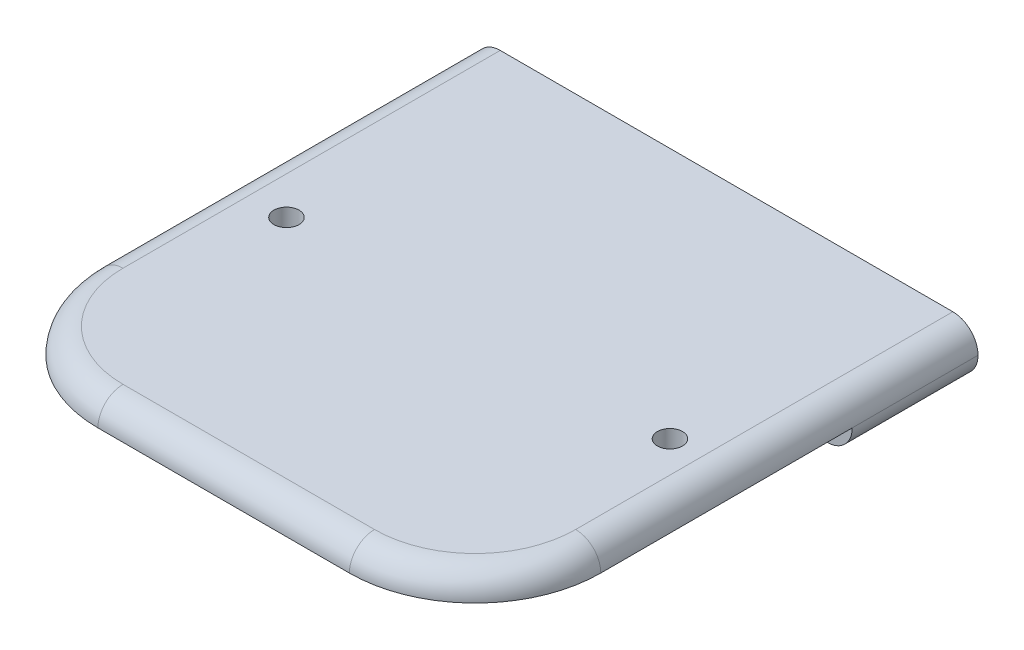
ISO-10303-21;
HEADER;
FILE_DESCRIPTION(('STEP AP214'),'2;1');
FILE_NAME('part.step','',(''),(''),'','','');
FILE_SCHEMA(('AUTOMOTIVE_DESIGN { 1 0 10303 214 1 1 1 1 }'));
ENDSEC;
DATA;
#1=APPLICATION_CONTEXT('core data for automotive mechanical design processes');
#2=APPLICATION_PROTOCOL_DEFINITION('international standard','automotive_design',2000,#1);
#3=PRODUCT_CONTEXT('',#1,'mechanical');
#4=PRODUCT('Part','Part','',(#3));
#5=PRODUCT_RELATED_PRODUCT_CATEGORY('part','',(#4));
#6=PRODUCT_DEFINITION_FORMATION('','',#4);
#7=PRODUCT_DEFINITION_CONTEXT('part definition',#1,'design');
#8=PRODUCT_DEFINITION('design','',#6,#7);
#9=PRODUCT_DEFINITION_SHAPE('','',#8);
#10=(LENGTH_UNIT() NAMED_UNIT(*) SI_UNIT(.MILLI.,.METRE.));
#11=(NAMED_UNIT(*) PLANE_ANGLE_UNIT() SI_UNIT($,.RADIAN.));
#12=(NAMED_UNIT(*) SI_UNIT($,.STERADIAN.) SOLID_ANGLE_UNIT());
#13=UNCERTAINTY_MEASURE_WITH_UNIT(LENGTH_MEASURE(1.E-05),#10,'distance_accuracy_value','');
#14=(GEOMETRIC_REPRESENTATION_CONTEXT(3) GLOBAL_UNCERTAINTY_ASSIGNED_CONTEXT((#13)) GLOBAL_UNIT_ASSIGNED_CONTEXT((#10,
#11,#12)) REPRESENTATION_CONTEXT('',''));
#15=CARTESIAN_POINT('',(0.,0.,0.));
#16=DIRECTION('',(0.,0.,1.));
#17=DIRECTION('',(1.,0.,0.));
#18=AXIS2_PLACEMENT_3D('',#15,#16,#17);
#19=CARTESIAN_POINT('',(0.,0.,40.));
#20=DIRECTION('',(0.,1.,0.));
#21=DIRECTION('',(0.,0.,1.));
#22=AXIS2_PLACEMENT_3D('',#19,#20,#21);
#23=PLANE('',#22);
#24=DIRECTION('',(1.,0.,0.));
#25=VECTOR('',#24,1.);
#26=CARTESIAN_POINT('',(0.,0.,10.));
#27=LINE('',#26,#25);
#28=CARTESIAN_POINT('',(2.,0.,10.));
#29=VERTEX_POINT('',#28);
#30=CARTESIAN_POINT('',(38.,0.,10.));
#31=VERTEX_POINT('',#30);
#32=EDGE_CURVE('E128',#29,#31,#27,.T.);
#33=ORIENTED_EDGE('',*,*,#32,.F.);
#34=DIRECTION('',(0.,0.,-1.));
#35=VECTOR('',#34,1.);
#36=CARTESIAN_POINT('',(2.,0.,40.));
#37=LINE('',#36,#35);
#38=CARTESIAN_POINT('',(2.,0.,0.));
#39=VERTEX_POINT('',#38);
#40=EDGE_CURVE('E136',#29,#39,#37,.T.);
#41=ORIENTED_EDGE('',*,*,#40,.T.);
#42=DIRECTION('',(1.,0.,0.));
#43=VECTOR('',#42,1.);
#44=CARTESIAN_POINT('',(0.,0.,0.));
#45=LINE('',#44,#43);
#46=CARTESIAN_POINT('',(38.,0.,0.));
#47=VERTEX_POINT('',#46);
#48=EDGE_CURVE('E211',#39,#47,#45,.T.);
#49=ORIENTED_EDGE('',*,*,#48,.T.);
#50=DIRECTION('',(0.,0.,-1.));
#51=VECTOR('',#50,1.);
#52=CARTESIAN_POINT('',(38.,0.,40.));
#53=LINE('',#52,#51);
#54=EDGE_CURVE('E143',#47,#31,#53,.F.);
#55=ORIENTED_EDGE('',*,*,#54,.T.);
#56=EDGE_LOOP('',(#33,#41,#49,#55));
#57=FACE_BOUND('',#56,.T.);
#58=ADVANCED_FACE('F38',(#57),#23,.F.);
#59=CARTESIAN_POINT('',(0.,4.,40.));
#60=DIRECTION('',(0.,-1.,0.));
#61=DIRECTION('',(0.,0.,-1.));
#62=AXIS2_PLACEMENT_3D('',#59,#60,#61);
#63=PLANE('',#62);
#64=CARTESIAN_POINT('',(5.00000000000001,4.,20.));
#65=DIRECTION('',(0.,1.,0.));
#66=DIRECTION('',(0.,0.,1.));
#67=AXIS2_PLACEMENT_3D('',#64,#65,#66);
#68=CIRCLE('',#67,1.);
#69=CARTESIAN_POINT('',(5.00000000000001,4.,21.));
#70=VERTEX_POINT('',#69);
#71=EDGE_CURVE('E158',#70,#70,#68,.T.);
#72=ORIENTED_EDGE('',*,*,#71,.F.);
#73=EDGE_LOOP('',(#72));
#74=FACE_BOUND('',#73,.T.);
#75=CARTESIAN_POINT('',(35.5,4.,20.));
#76=DIRECTION('',(0.,1.,0.));
#77=DIRECTION('',(0.,0.,1.));
#78=AXIS2_PLACEMENT_3D('',#75,#76,#77);
#79=CIRCLE('',#78,0.999999999999998);
#80=CARTESIAN_POINT('',(35.5,4.,21.));
#81=VERTEX_POINT('',#80);
#82=EDGE_CURVE('E203',#81,#81,#79,.T.);
#83=ORIENTED_EDGE('',*,*,#82,.F.);
#84=EDGE_LOOP('',(#83));
#85=FACE_BOUND('',#84,.T.);
#86=DIRECTION('',(-1.,0.,0.));
#87=VECTOR('',#86,1.);
#88=CARTESIAN_POINT('',(0.,4.,0.));
#89=LINE('',#88,#87);
#90=CARTESIAN_POINT('',(38.,4.,0.));
#91=VERTEX_POINT('',#90);
#92=CARTESIAN_POINT('',(2.,4.,0.));
#93=VERTEX_POINT('',#92);
#94=EDGE_CURVE('E198',#91,#93,#89,.T.);
#95=ORIENTED_EDGE('',*,*,#94,.T.);
#96=DIRECTION('',(0.,0.,-1.));
#97=VECTOR('',#96,1.);
#98=CARTESIAN_POINT('',(2.,4.,40.));
#99=LINE('',#98,#97);
#100=CARTESIAN_POINT('',(2.,4.,30.));
#101=VERTEX_POINT('',#100);
#102=EDGE_CURVE('E173',#93,#101,#99,.F.);
#103=ORIENTED_EDGE('',*,*,#102,.T.);
#104=CARTESIAN_POINT('',(10.,4.,30.));
#105=DIRECTION('',(0.,-1.,0.));
#106=DIRECTION('',(0.,0.,-1.));
#107=AXIS2_PLACEMENT_3D('',#104,#105,#106);
#108=CIRCLE('',#107,8.);
#109=CARTESIAN_POINT('',(10.,4.,38.));
#110=VERTEX_POINT('',#109);
#111=EDGE_CURVE('E176',#101,#110,#108,.F.);
#112=ORIENTED_EDGE('',*,*,#111,.T.);
#113=DIRECTION('',(-1.,0.,0.));
#114=VECTOR('',#113,1.);
#115=CARTESIAN_POINT('',(0.,4.,38.));
#116=LINE('',#115,#114);
#117=CARTESIAN_POINT('',(30.,4.,38.));
#118=VERTEX_POINT('',#117);
#119=EDGE_CURVE('E179',#110,#118,#116,.F.);
#120=ORIENTED_EDGE('',*,*,#119,.T.);
#121=CARTESIAN_POINT('',(30.,4.,30.));
#122=DIRECTION('',(0.,-1.,0.));
#123=DIRECTION('',(0.,0.,-1.));
#124=AXIS2_PLACEMENT_3D('',#121,#122,#123);
#125=CIRCLE('',#124,8.);
#126=CARTESIAN_POINT('',(38.,4.,30.));
#127=VERTEX_POINT('',#126);
#128=EDGE_CURVE('E182',#118,#127,#125,.F.);
#129=ORIENTED_EDGE('',*,*,#128,.T.);
#130=DIRECTION('',(0.,0.,-1.));
#131=VECTOR('',#130,1.);
#132=CARTESIAN_POINT('',(38.,4.,40.));
#133=LINE('',#132,#131);
#134=EDGE_CURVE('E185',#127,#91,#133,.T.);
#135=ORIENTED_EDGE('',*,*,#134,.T.);
#136=EDGE_LOOP('',(#95,#103,#112,#120,#129,#135));
#137=FACE_BOUND('',#136,.T.);
#138=ADVANCED_FACE('F230',(#74,#85,#137),#63,.F.);
#139=CARTESIAN_POINT('',(0.,0.,0.));
#140=DIRECTION('',(0.,0.,-1.));
#141=DIRECTION('',(-1.,0.,0.));
#142=AXIS2_PLACEMENT_3D('',#139,#140,#141);
#143=PLANE('',#142);
#144=ORIENTED_EDGE('',*,*,#48,.F.);
#145=CARTESIAN_POINT('',(2.,2.,0.));
#146=DIRECTION('',(0.,0.,-1.));
#147=DIRECTION('',(-1.,0.,0.));
#148=AXIS2_PLACEMENT_3D('',#145,#146,#147);
#149=CIRCLE('',#148,2.);
#150=CARTESIAN_POINT('',(0.,2.,0.));
#151=VERTEX_POINT('',#150);
#152=EDGE_CURVE('E47',#39,#151,#149,.T.);
#153=ORIENTED_EDGE('',*,*,#152,.T.);
#154=CARTESIAN_POINT('',(2.,2.,0.));
#155=DIRECTION('',(0.,0.,-1.));
#156=DIRECTION('',(-1.,0.,0.));
#157=AXIS2_PLACEMENT_3D('',#154,#155,#156);
#158=CIRCLE('',#157,2.);
#159=EDGE_CURVE('E115',#151,#93,#158,.T.);
#160=ORIENTED_EDGE('',*,*,#159,.T.);
#161=ORIENTED_EDGE('',*,*,#94,.F.);
#162=CARTESIAN_POINT('',(38.,2.,0.));
#163=DIRECTION('',(0.,0.,-1.));
#164=DIRECTION('',(-1.,0.,0.));
#165=AXIS2_PLACEMENT_3D('',#162,#163,#164);
#166=CIRCLE('',#165,2.);
#167=CARTESIAN_POINT('',(40.,2.,0.));
#168=VERTEX_POINT('',#167);
#169=EDGE_CURVE('E117',#91,#168,#166,.T.);
#170=ORIENTED_EDGE('',*,*,#169,.T.);
#171=CARTESIAN_POINT('',(38.,2.,0.));
#172=DIRECTION('',(0.,0.,-1.));
#173=DIRECTION('',(-1.,0.,0.));
#174=AXIS2_PLACEMENT_3D('',#171,#172,#173);
#175=CIRCLE('',#174,2.);
#176=EDGE_CURVE('E149',#168,#47,#175,.T.);
#177=ORIENTED_EDGE('',*,*,#176,.T.);
#178=EDGE_LOOP('',(#144,#153,#160,#161,#170,#177));
#179=FACE_BOUND('',#178,.T.);
#180=ADVANCED_FACE('F233',(#179),#143,.T.);
#181=CARTESIAN_POINT('',(0.,2.,10.));
#182=DIRECTION('',(0.,0.,-1.));
#183=DIRECTION('',(-1.,0.,0.));
#184=AXIS2_PLACEMENT_3D('',#181,#182,#183);
#185=PLANE('',#184);
#186=DIRECTION('',(1.,0.,0.));
#187=VECTOR('',#186,1.);
#188=CARTESIAN_POINT('',(0.,2.,10.));
#189=LINE('',#188,#187);
#190=CARTESIAN_POINT('',(0.,2.,10.));
#191=VERTEX_POINT('',#190);
#192=CARTESIAN_POINT('',(40.,2.,10.));
#193=VERTEX_POINT('',#192);
#194=EDGE_CURVE('E123',#191,#193,#189,.T.);
#195=ORIENTED_EDGE('',*,*,#194,.F.);
#196=CARTESIAN_POINT('',(2.,2.,10.));
#197=DIRECTION('',(0.,0.,-1.));
#198=DIRECTION('',(-1.,0.,0.));
#199=AXIS2_PLACEMENT_3D('',#196,#197,#198);
#200=CIRCLE('',#199,2.);
#201=EDGE_CURVE('E11',#191,#29,#200,.F.);
#202=ORIENTED_EDGE('',*,*,#201,.T.);
#203=ORIENTED_EDGE('',*,*,#32,.T.);
#204=CARTESIAN_POINT('',(38.,2.,10.));
#205=DIRECTION('',(0.,0.,-1.));
#206=DIRECTION('',(-1.,0.,0.));
#207=AXIS2_PLACEMENT_3D('',#204,#205,#206);
#208=CIRCLE('',#207,2.);
#209=EDGE_CURVE('E132',#31,#193,#208,.F.);
#210=ORIENTED_EDGE('',*,*,#209,.T.);
#211=EDGE_LOOP('',(#195,#202,#203,#210));
#212=FACE_BOUND('',#211,.T.);
#213=ADVANCED_FACE('F130',(#212),#185,.F.);
#214=CARTESIAN_POINT('',(0.,2.,0.));
#215=DIRECTION('',(0.,-1.,0.));
#216=DIRECTION('',(0.,0.,-1.));
#217=AXIS2_PLACEMENT_3D('',#214,#215,#216);
#218=PLANE('',#217);
#219=CARTESIAN_POINT('',(5.00000000000001,2.,20.));
#220=DIRECTION('',(0.,-1.,0.));
#221=DIRECTION('',(0.,0.,-1.));
#222=AXIS2_PLACEMENT_3D('',#219,#220,#221);
#223=CIRCLE('',#222,1.);
#224=CARTESIAN_POINT('',(5.00000000000001,2.,19.));
#225=VERTEX_POINT('',#224);
#226=EDGE_CURVE('E199',#225,#225,#223,.T.);
#227=ORIENTED_EDGE('',*,*,#226,.F.);
#228=EDGE_LOOP('',(#227));
#229=FACE_BOUND('',#228,.T.);
#230=CARTESIAN_POINT('',(35.5,2.,20.));
#231=DIRECTION('',(0.,-1.,0.));
#232=DIRECTION('',(0.,0.,-1.));
#233=AXIS2_PLACEMENT_3D('',#230,#231,#232);
#234=CIRCLE('',#233,0.999999999999998);
#235=CARTESIAN_POINT('',(35.5,2.,19.));
#236=VERTEX_POINT('',#235);
#237=EDGE_CURVE('E204',#236,#236,#234,.T.);
#238=ORIENTED_EDGE('',*,*,#237,.F.);
#239=EDGE_LOOP('',(#238));
#240=FACE_BOUND('',#239,.T.);
#241=DIRECTION('',(-1.,0.,0.));
#242=VECTOR('',#241,1.);
#243=CARTESIAN_POINT('',(0.,2.,40.));
#244=LINE('',#243,#242);
#245=CARTESIAN_POINT('',(30.,2.,40.));
#246=VERTEX_POINT('',#245);
#247=CARTESIAN_POINT('',(10.,2.,40.));
#248=VERTEX_POINT('',#247);
#249=EDGE_CURVE('E214',#246,#248,#244,.T.);
#250=ORIENTED_EDGE('',*,*,#249,.T.);
#251=CARTESIAN_POINT('',(10.,2.,30.));
#252=DIRECTION('',(0.,-1.,0.));
#253=DIRECTION('',(0.,0.,-1.));
#254=AXIS2_PLACEMENT_3D('',#251,#252,#253);
#255=CIRCLE('',#254,10.);
#256=CARTESIAN_POINT('',(0.,2.,30.));
#257=VERTEX_POINT('',#256);
#258=EDGE_CURVE('E118',#248,#257,#255,.T.);
#259=ORIENTED_EDGE('',*,*,#258,.T.);
#260=DIRECTION('',(0.,0.,-1.));
#261=VECTOR('',#260,1.);
#262=CARTESIAN_POINT('',(0.,2.,40.));
#263=LINE('',#262,#261);
#264=EDGE_CURVE('E113',#257,#191,#263,.T.);
#265=ORIENTED_EDGE('',*,*,#264,.T.);
#266=ORIENTED_EDGE('',*,*,#194,.T.);
#267=DIRECTION('',(0.,0.,1.));
#268=VECTOR('',#267,1.);
#269=CARTESIAN_POINT('',(40.,2.,40.));
#270=LINE('',#269,#268);
#271=CARTESIAN_POINT('',(40.,2.,30.));
#272=VERTEX_POINT('',#271);
#273=EDGE_CURVE('E134',#193,#272,#270,.T.);
#274=ORIENTED_EDGE('',*,*,#273,.T.);
#275=CARTESIAN_POINT('',(30.,2.,30.));
#276=DIRECTION('',(0.,-1.,0.));
#277=DIRECTION('',(0.,0.,-1.));
#278=AXIS2_PLACEMENT_3D('',#275,#276,#277);
#279=CIRCLE('',#278,10.);
#280=EDGE_CURVE('E195',#272,#246,#279,.T.);
#281=ORIENTED_EDGE('',*,*,#280,.T.);
#282=EDGE_LOOP('',(#250,#259,#265,#266,#274,#281));
#283=FACE_BOUND('',#282,.T.);
#284=ADVANCED_FACE('F122',(#229,#240,#283),#218,.T.);
#285=CARTESIAN_POINT('',(35.5,0.,20.));
#286=DIRECTION('',(0.,1.,0.));
#287=DIRECTION('',(0.,0.,1.));
#288=AXIS2_PLACEMENT_3D('',#285,#286,#287);
#289=CYLINDRICAL_SURFACE('',#288,0.999999999999998);
#290=ORIENTED_EDGE('',*,*,#237,.T.);
#291=EDGE_LOOP('',(#290));
#292=FACE_BOUND('',#291,.T.);
#293=ORIENTED_EDGE('',*,*,#82,.T.);
#294=EDGE_LOOP('',(#293));
#295=FACE_BOUND('',#294,.T.);
#296=ADVANCED_FACE('F299',(#292,#295),#289,.F.);
#297=CARTESIAN_POINT('',(5.00000000000001,0.,20.));
#298=DIRECTION('',(0.,1.,0.));
#299=DIRECTION('',(0.,0.,1.));
#300=AXIS2_PLACEMENT_3D('',#297,#298,#299);
#301=CYLINDRICAL_SURFACE('',#300,1.);
#302=ORIENTED_EDGE('',*,*,#226,.T.);
#303=EDGE_LOOP('',(#302));
#304=FACE_BOUND('',#303,.T.);
#305=ORIENTED_EDGE('',*,*,#71,.T.);
#306=EDGE_LOOP('',(#305));
#307=FACE_BOUND('',#306,.T.);
#308=ADVANCED_FACE('F228',(#304,#307),#301,.F.);
#309=CARTESIAN_POINT('',(38.,2.,40.));
#310=DIRECTION('',(0.,0.,-1.));
#311=DIRECTION('',(-1.,0.,0.));
#312=AXIS2_PLACEMENT_3D('',#309,#310,#311);
#313=CYLINDRICAL_SURFACE('',#312,2.);
#314=ORIENTED_EDGE('',*,*,#169,.F.);
#315=ORIENTED_EDGE('',*,*,#134,.F.);
#316=CARTESIAN_POINT('',(38.,2.,30.));
#317=DIRECTION('',(0.,0.,1.));
#318=DIRECTION('',(1.,0.,0.));
#319=AXIS2_PLACEMENT_3D('',#316,#317,#318);
#320=CIRCLE('',#319,2.);
#321=EDGE_CURVE('E154',#272,#127,#320,.T.);
#322=ORIENTED_EDGE('',*,*,#321,.F.);
#323=ORIENTED_EDGE('',*,*,#273,.F.);
#324=DIRECTION('',(0.,0.,-1.));
#325=VECTOR('',#324,1.);
#326=CARTESIAN_POINT('',(40.,2.,40.));
#327=LINE('',#326,#325);
#328=EDGE_CURVE('E153',#168,#193,#327,.F.);
#329=ORIENTED_EDGE('',*,*,#328,.F.);
#330=EDGE_LOOP('',(#314,#315,#322,#323,#329));
#331=FACE_BOUND('',#330,.T.);
#332=ADVANCED_FACE('F256',(#331),#313,.T.);
#333=CARTESIAN_POINT('',(30.,2.,30.));
#334=DIRECTION('',(0.,-1.,0.));
#335=DIRECTION('',(0.,0.,-1.));
#336=AXIS2_PLACEMENT_3D('',#333,#334,#335);
#337=TOROIDAL_SURFACE('',#336,8.,2.);
#338=ORIENTED_EDGE('',*,*,#321,.T.);
#339=ORIENTED_EDGE('',*,*,#128,.F.);
#340=CARTESIAN_POINT('',(30.,2.,38.));
#341=DIRECTION('',(-1.,0.,0.));
#342=DIRECTION('',(0.,0.,1.));
#343=AXIS2_PLACEMENT_3D('',#340,#341,#342);
#344=CIRCLE('',#343,2.);
#345=EDGE_CURVE('E159',#246,#118,#344,.T.);
#346=ORIENTED_EDGE('',*,*,#345,.F.);
#347=ORIENTED_EDGE('',*,*,#280,.F.);
#348=EDGE_LOOP('',(#338,#339,#346,#347));
#349=FACE_BOUND('',#348,.T.);
#350=ADVANCED_FACE('F253',(#349),#337,.T.);
#351=CARTESIAN_POINT('',(0.,2.,38.));
#352=DIRECTION('',(-1.,0.,0.));
#353=DIRECTION('',(0.,0.,1.));
#354=AXIS2_PLACEMENT_3D('',#351,#352,#353);
#355=CYLINDRICAL_SURFACE('',#354,2.);
#356=ORIENTED_EDGE('',*,*,#345,.T.);
#357=ORIENTED_EDGE('',*,*,#119,.F.);
#358=CARTESIAN_POINT('',(10.,2.,38.));
#359=DIRECTION('',(-1.,0.,0.));
#360=DIRECTION('',(0.,0.,1.));
#361=AXIS2_PLACEMENT_3D('',#358,#359,#360);
#362=CIRCLE('',#361,2.);
#363=EDGE_CURVE('E163',#248,#110,#362,.T.);
#364=ORIENTED_EDGE('',*,*,#363,.F.);
#365=ORIENTED_EDGE('',*,*,#249,.F.);
#366=EDGE_LOOP('',(#356,#357,#364,#365));
#367=FACE_BOUND('',#366,.T.);
#368=ADVANCED_FACE('F248',(#367),#355,.T.);
#369=CARTESIAN_POINT('',(10.,2.,30.));
#370=DIRECTION('',(0.,-1.,0.));
#371=DIRECTION('',(0.,0.,-1.));
#372=AXIS2_PLACEMENT_3D('',#369,#370,#371);
#373=TOROIDAL_SURFACE('',#372,8.,2.);
#374=ORIENTED_EDGE('',*,*,#363,.T.);
#375=ORIENTED_EDGE('',*,*,#111,.F.);
#376=CARTESIAN_POINT('',(2.,2.,30.));
#377=DIRECTION('',(0.,0.,-1.));
#378=DIRECTION('',(-1.,0.,0.));
#379=AXIS2_PLACEMENT_3D('',#376,#377,#378);
#380=CIRCLE('',#379,2.);
#381=EDGE_CURVE('E167',#257,#101,#380,.T.);
#382=ORIENTED_EDGE('',*,*,#381,.F.);
#383=ORIENTED_EDGE('',*,*,#258,.F.);
#384=EDGE_LOOP('',(#374,#375,#382,#383));
#385=FACE_BOUND('',#384,.T.);
#386=ADVANCED_FACE('F243',(#385),#373,.T.);
#387=CARTESIAN_POINT('',(2.,2.,40.));
#388=DIRECTION('',(0.,0.,-1.));
#389=DIRECTION('',(-1.,0.,0.));
#390=AXIS2_PLACEMENT_3D('',#387,#388,#389);
#391=CYLINDRICAL_SURFACE('',#390,2.);
#392=ORIENTED_EDGE('',*,*,#381,.T.);
#393=ORIENTED_EDGE('',*,*,#102,.F.);
#394=ORIENTED_EDGE('',*,*,#159,.F.);
#395=DIRECTION('',(0.,0.,-1.));
#396=VECTOR('',#395,1.);
#397=CARTESIAN_POINT('',(0.,2.,40.));
#398=LINE('',#397,#396);
#399=EDGE_CURVE('E109',#191,#151,#398,.T.);
#400=ORIENTED_EDGE('',*,*,#399,.F.);
#401=ORIENTED_EDGE('',*,*,#264,.F.);
#402=EDGE_LOOP('',(#392,#393,#394,#400,#401));
#403=FACE_BOUND('',#402,.T.);
#404=ADVANCED_FACE('F112',(#403),#391,.T.);
#405=CARTESIAN_POINT('',(38.,2.,40.));
#406=DIRECTION('',(0.,0.,-1.));
#407=DIRECTION('',(-1.,0.,0.));
#408=AXIS2_PLACEMENT_3D('',#405,#406,#407);
#409=CYLINDRICAL_SURFACE('',#408,2.);
#410=ORIENTED_EDGE('',*,*,#209,.F.);
#411=ORIENTED_EDGE('',*,*,#54,.F.);
#412=ORIENTED_EDGE('',*,*,#176,.F.);
#413=ORIENTED_EDGE('',*,*,#328,.T.);
#414=EDGE_LOOP('',(#410,#411,#412,#413));
#415=FACE_BOUND('',#414,.T.);
#416=ADVANCED_FACE('F260',(#415),#409,.T.);
#417=CARTESIAN_POINT('',(2.,2.,40.));
#418=DIRECTION('',(0.,0.,-1.));
#419=DIRECTION('',(-1.,0.,0.));
#420=AXIS2_PLACEMENT_3D('',#417,#418,#419);
#421=CYLINDRICAL_SURFACE('',#420,2.);
#422=ORIENTED_EDGE('',*,*,#201,.F.);
#423=ORIENTED_EDGE('',*,*,#399,.T.);
#424=ORIENTED_EDGE('',*,*,#152,.F.);
#425=ORIENTED_EDGE('',*,*,#40,.F.);
#426=EDGE_LOOP('',(#422,#423,#424,#425));
#427=FACE_BOUND('',#426,.T.);
#428=ADVANCED_FACE('F40',(#427),#421,.T.);
#429=CLOSED_SHELL('',(#58,#138,#180,#213,#284,#296,#308,#332,#350,#368,#386,#404,#416,#428));
#430=MANIFOLD_SOLID_BREP('B2',#429);
#431=ADVANCED_BREP_SHAPE_REPRESENTATION('',(#18,#430),#14);
#432=SHAPE_DEFINITION_REPRESENTATION(#9,#431);
ENDSEC;
END-ISO-10303-21;
